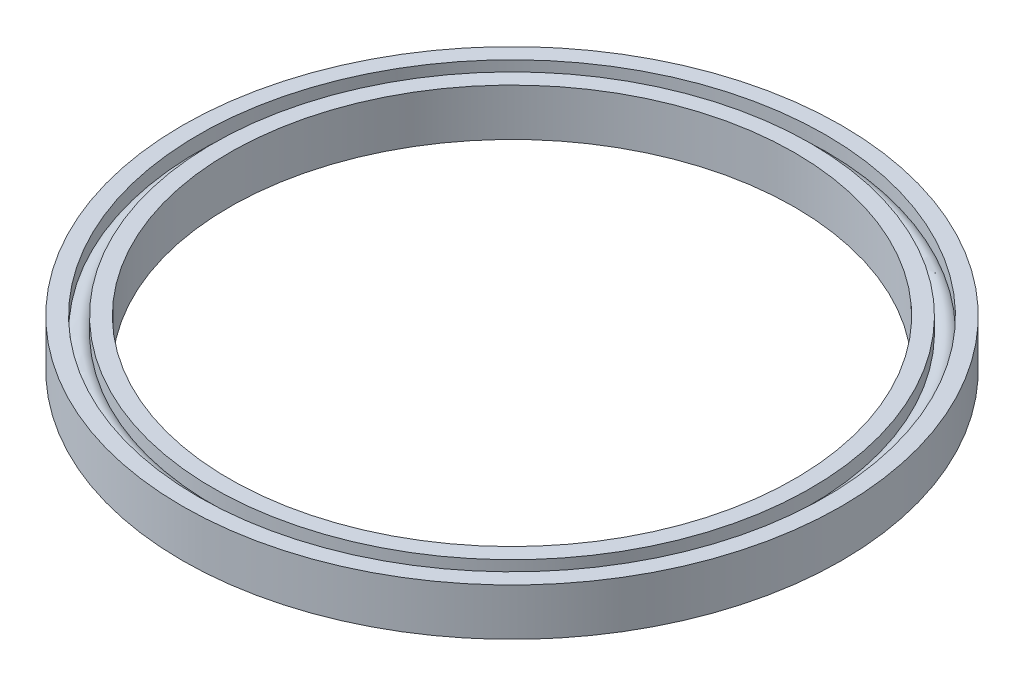
ISO-10303-21;
HEADER;
FILE_DESCRIPTION(('STEP AP214'),'2;1');
FILE_NAME('part.step','',(''),(''),'','','');
FILE_SCHEMA(('AUTOMOTIVE_DESIGN { 1 0 10303 214 1 1 1 1 }'));
ENDSEC;
DATA;
#1=APPLICATION_CONTEXT('core data for automotive mechanical design processes');
#2=APPLICATION_PROTOCOL_DEFINITION('international standard','automotive_design',2000,#1);
#3=PRODUCT_CONTEXT('',#1,'mechanical');
#4=PRODUCT('Part','Part','',(#3));
#5=PRODUCT_RELATED_PRODUCT_CATEGORY('part','',(#4));
#6=PRODUCT_DEFINITION_FORMATION('','',#4);
#7=PRODUCT_DEFINITION_CONTEXT('part definition',#1,'design');
#8=PRODUCT_DEFINITION('design','',#6,#7);
#9=PRODUCT_DEFINITION_SHAPE('','',#8);
#10=(LENGTH_UNIT() NAMED_UNIT(*) SI_UNIT(.MILLI.,.METRE.));
#11=(NAMED_UNIT(*) PLANE_ANGLE_UNIT() SI_UNIT($,.RADIAN.));
#12=(NAMED_UNIT(*) SI_UNIT($,.STERADIAN.) SOLID_ANGLE_UNIT());
#13=UNCERTAINTY_MEASURE_WITH_UNIT(LENGTH_MEASURE(1.E-05),#10,'distance_accuracy_value','');
#14=(GEOMETRIC_REPRESENTATION_CONTEXT(3) GLOBAL_UNCERTAINTY_ASSIGNED_CONTEXT((#13)) GLOBAL_UNIT_ASSIGNED_CONTEXT((#10,
#11,#12)) REPRESENTATION_CONTEXT('',''));
#15=CARTESIAN_POINT('',(0.,0.,0.));
#16=DIRECTION('',(0.,0.,1.));
#17=DIRECTION('',(1.,0.,0.));
#18=AXIS2_PLACEMENT_3D('',#15,#16,#17);
#19=CARTESIAN_POINT('',(0.,13.35,0.));
#20=DIRECTION('',(0.,-1.,0.));
#21=DIRECTION('',(0.,0.,-1.));
#22=AXIS2_PLACEMENT_3D('',#19,#20,#21);
#23=CYLINDRICAL_SURFACE('',#22,42.275);
#24=CARTESIAN_POINT('',(0.,4.40794616670801,0.));
#25=DIRECTION('',(0.,-1.,0.));
#26=DIRECTION('',(0.,0.,-1.));
#27=AXIS2_PLACEMENT_3D('',#24,#25,#26);
#28=CIRCLE('',#27,42.275);
#29=CARTESIAN_POINT('',(0.,4.40794616670801,-42.275));
#30=VERTEX_POINT('',#29);
#31=EDGE_CURVE('E10',#30,#30,#28,.T.);
#32=ORIENTED_EDGE('',*,*,#31,.T.);
#33=EDGE_LOOP('',(#32));
#34=FACE_BOUND('',#33,.T.);
#35=CARTESIAN_POINT('',(0.,6.35,0.));
#36=DIRECTION('',(0.,-1.,0.));
#37=DIRECTION('',(0.,0.,-1.));
#38=AXIS2_PLACEMENT_3D('',#35,#36,#37);
#39=CIRCLE('',#38,42.275);
#40=CARTESIAN_POINT('',(0.,6.35,-42.275));
#41=VERTEX_POINT('',#40);
#42=EDGE_CURVE('E81',#41,#41,#39,.T.);
#43=ORIENTED_EDGE('',*,*,#42,.F.);
#44=EDGE_LOOP('',(#43));
#45=FACE_BOUND('',#44,.T.);
#46=ADVANCED_FACE('F41',(#34,#45),#23,.F.);
#47=CARTESIAN_POINT('',(0.,3.175,0.));
#48=DIRECTION('',(0.,-1.,0.));
#49=DIRECTION('',(0.,0.,-1.));
#50=AXIS2_PLACEMENT_3D('',#47,#48,#49);
#51=TOROIDAL_SURFACE('',#50,41.275,1.5875);
#52=CARTESIAN_POINT('',(0.,4.40794616670801,0.));
#53=DIRECTION('',(0.,-1.,0.));
#54=DIRECTION('',(0.,0.,-1.));
#55=AXIS2_PLACEMENT_3D('',#52,#53,#54);
#56=CIRCLE('',#55,40.275);
#57=CARTESIAN_POINT('',(0.,4.40794616670801,-40.275));
#58=VERTEX_POINT('',#57);
#59=EDGE_CURVE('E47',#58,#58,#56,.T.);
#60=ORIENTED_EDGE('',*,*,#59,.T.);
#61=EDGE_LOOP('',(#60));
#62=FACE_BOUND('',#61,.T.);
#63=ORIENTED_EDGE('',*,*,#31,.F.);
#64=EDGE_LOOP('',(#63));
#65=FACE_BOUND('',#64,.T.);
#66=ADVANCED_FACE('F88',(#62,#65),#51,.T.);
#67=CARTESIAN_POINT('',(0.,13.35,0.));
#68=DIRECTION('',(0.,-1.,0.));
#69=DIRECTION('',(0.,0.,-1.));
#70=AXIS2_PLACEMENT_3D('',#67,#68,#69);
#71=CYLINDRICAL_SURFACE('',#70,40.275);
#72=ORIENTED_EDGE('',*,*,#59,.F.);
#73=EDGE_LOOP('',(#72));
#74=FACE_BOUND('',#73,.T.);
#75=CARTESIAN_POINT('',(0.,6.35,0.));
#76=DIRECTION('',(0.,-1.,0.));
#77=DIRECTION('',(0.,0.,-1.));
#78=AXIS2_PLACEMENT_3D('',#75,#76,#77);
#79=CIRCLE('',#78,40.275);
#80=CARTESIAN_POINT('',(0.,6.35,-40.275));
#81=VERTEX_POINT('',#80);
#82=EDGE_CURVE('E51',#81,#81,#79,.T.);
#83=ORIENTED_EDGE('',*,*,#82,.T.);
#84=EDGE_LOOP('',(#83));
#85=FACE_BOUND('',#84,.T.);
#86=ADVANCED_FACE('F92',(#74,#85),#71,.T.);
#87=CARTESIAN_POINT('',(0.,6.35,0.));
#88=DIRECTION('',(0.,-1.,0.));
#89=DIRECTION('',(0.,0.,-1.));
#90=AXIS2_PLACEMENT_3D('',#87,#88,#89);
#91=PLANE('',#90);
#92=ORIENTED_EDGE('',*,*,#82,.F.);
#93=EDGE_LOOP('',(#92));
#94=FACE_BOUND('',#93,.T.);
#95=CARTESIAN_POINT('',(0.,6.35,0.));
#96=DIRECTION('',(0.,-1.,0.));
#97=DIRECTION('',(0.,0.,-1.));
#98=AXIS2_PLACEMENT_3D('',#95,#96,#97);
#99=CIRCLE('',#98,38.1);
#100=CARTESIAN_POINT('',(0.,6.35,-38.1));
#101=VERTEX_POINT('',#100);
#102=EDGE_CURVE('E55',#101,#101,#99,.T.);
#103=ORIENTED_EDGE('',*,*,#102,.T.);
#104=EDGE_LOOP('',(#103));
#105=FACE_BOUND('',#104,.T.);
#106=ADVANCED_FACE('F98',(#94,#105),#91,.F.);
#107=CARTESIAN_POINT('',(0.,13.35,0.));
#108=DIRECTION('',(0.,-1.,0.));
#109=DIRECTION('',(0.,0.,-1.));
#110=AXIS2_PLACEMENT_3D('',#107,#108,#109);
#111=CYLINDRICAL_SURFACE('',#110,38.1);
#112=CARTESIAN_POINT('',(0.,0.,0.));
#113=DIRECTION('',(0.,-1.,0.));
#114=DIRECTION('',(0.,0.,-1.));
#115=AXIS2_PLACEMENT_3D('',#112,#113,#114);
#116=CIRCLE('',#115,38.1);
#117=CARTESIAN_POINT('',(0.,0.,-38.1));
#118=VERTEX_POINT('',#117);
#119=EDGE_CURVE('E60',#118,#118,#116,.T.);
#120=ORIENTED_EDGE('',*,*,#119,.T.);
#121=EDGE_LOOP('',(#120));
#122=FACE_BOUND('',#121,.T.);
#123=ORIENTED_EDGE('',*,*,#102,.F.);
#124=EDGE_LOOP('',(#123));
#125=FACE_BOUND('',#124,.T.);
#126=ADVANCED_FACE('F123',(#122,#125),#111,.F.);
#127=CARTESIAN_POINT('',(0.,0.,0.));
#128=DIRECTION('',(0.,-1.,0.));
#129=DIRECTION('',(0.,0.,-1.));
#130=AXIS2_PLACEMENT_3D('',#127,#128,#129);
#131=PLANE('',#130);
#132=CARTESIAN_POINT('',(0.,0.,0.));
#133=DIRECTION('',(0.,-1.,0.));
#134=DIRECTION('',(0.,0.,-1.));
#135=AXIS2_PLACEMENT_3D('',#132,#133,#134);
#136=CIRCLE('',#135,40.275);
#137=CARTESIAN_POINT('',(0.,0.,-40.275));
#138=VERTEX_POINT('',#137);
#139=EDGE_CURVE('E63',#138,#138,#136,.T.);
#140=ORIENTED_EDGE('',*,*,#139,.T.);
#141=EDGE_LOOP('',(#140));
#142=FACE_BOUND('',#141,.T.);
#143=ORIENTED_EDGE('',*,*,#119,.F.);
#144=EDGE_LOOP('',(#143));
#145=FACE_BOUND('',#144,.T.);
#146=ADVANCED_FACE('F113',(#142,#145),#131,.T.);
#147=CARTESIAN_POINT('',(0.,13.35,0.));
#148=DIRECTION('',(0.,-1.,0.));
#149=DIRECTION('',(0.,0.,-1.));
#150=AXIS2_PLACEMENT_3D('',#147,#148,#149);
#151=CYLINDRICAL_SURFACE('',#150,40.275);
#152=ORIENTED_EDGE('',*,*,#139,.F.);
#153=EDGE_LOOP('',(#152));
#154=FACE_BOUND('',#153,.T.);
#155=CARTESIAN_POINT('',(0.,1.94205383329199,0.));
#156=DIRECTION('',(0.,-1.,0.));
#157=DIRECTION('',(0.,0.,-1.));
#158=AXIS2_PLACEMENT_3D('',#155,#156,#157);
#159=CIRCLE('',#158,40.275);
#160=CARTESIAN_POINT('',(0.,1.94205383329199,-40.275));
#161=VERTEX_POINT('',#160);
#162=EDGE_CURVE('E66',#161,#161,#159,.T.);
#163=ORIENTED_EDGE('',*,*,#162,.T.);
#164=EDGE_LOOP('',(#163));
#165=FACE_BOUND('',#164,.T.);
#166=ADVANCED_FACE('F105',(#154,#165),#151,.T.);
#167=CARTESIAN_POINT('',(0.,1.94205383329199,0.));
#168=DIRECTION('',(0.,-1.,0.));
#169=DIRECTION('',(0.,0.,-1.));
#170=AXIS2_PLACEMENT_3D('',#167,#168,#169);
#171=CIRCLE('',#170,42.275);
#172=CARTESIAN_POINT('',(0.,1.94205383329199,-42.275));
#173=VERTEX_POINT('',#172);
#174=EDGE_CURVE('E69',#173,#173,#171,.T.);
#175=ORIENTED_EDGE('',*,*,#174,.T.);
#176=EDGE_LOOP('',(#175));
#177=FACE_BOUND('',#176,.T.);
#178=ORIENTED_EDGE('',*,*,#162,.F.);
#179=EDGE_LOOP('',(#178));
#180=FACE_BOUND('',#179,.T.);
#181=ADVANCED_FACE('F94',(#177,#180),#51,.T.);
#182=CARTESIAN_POINT('',(0.,13.35,0.));
#183=DIRECTION('',(0.,-1.,0.));
#184=DIRECTION('',(0.,0.,-1.));
#185=AXIS2_PLACEMENT_3D('',#182,#183,#184);
#186=CYLINDRICAL_SURFACE('',#185,42.275);
#187=CARTESIAN_POINT('',(0.,0.,0.));
#188=DIRECTION('',(0.,-1.,0.));
#189=DIRECTION('',(0.,0.,-1.));
#190=AXIS2_PLACEMENT_3D('',#187,#188,#189);
#191=CIRCLE('',#190,42.275);
#192=CARTESIAN_POINT('',(0.,0.,-42.275));
#193=VERTEX_POINT('',#192);
#194=EDGE_CURVE('E72',#193,#193,#191,.T.);
#195=ORIENTED_EDGE('',*,*,#194,.T.);
#196=EDGE_LOOP('',(#195));
#197=FACE_BOUND('',#196,.T.);
#198=ORIENTED_EDGE('',*,*,#174,.F.);
#199=EDGE_LOOP('',(#198));
#200=FACE_BOUND('',#199,.T.);
#201=ADVANCED_FACE('F104',(#197,#200),#186,.F.);
#202=CARTESIAN_POINT('',(0.,0.,0.));
#203=DIRECTION('',(0.,-1.,0.));
#204=DIRECTION('',(0.,0.,-1.));
#205=AXIS2_PLACEMENT_3D('',#202,#203,#204);
#206=PLANE('',#205);
#207=CARTESIAN_POINT('',(0.,0.,0.));
#208=DIRECTION('',(0.,-1.,0.));
#209=DIRECTION('',(0.,0.,-1.));
#210=AXIS2_PLACEMENT_3D('',#207,#208,#209);
#211=CIRCLE('',#210,44.45);
#212=CARTESIAN_POINT('',(0.,0.,-44.45));
#213=VERTEX_POINT('',#212);
#214=EDGE_CURVE('E75',#213,#213,#211,.T.);
#215=ORIENTED_EDGE('',*,*,#214,.T.);
#216=EDGE_LOOP('',(#215));
#217=FACE_BOUND('',#216,.T.);
#218=ORIENTED_EDGE('',*,*,#194,.F.);
#219=EDGE_LOOP('',(#218));
#220=FACE_BOUND('',#219,.T.);
#221=ADVANCED_FACE('F111',(#217,#220),#206,.T.);
#222=CARTESIAN_POINT('',(0.,13.35,0.));
#223=DIRECTION('',(0.,-1.,0.));
#224=DIRECTION('',(0.,0.,-1.));
#225=AXIS2_PLACEMENT_3D('',#222,#223,#224);
#226=CYLINDRICAL_SURFACE('',#225,44.45);
#227=ORIENTED_EDGE('',*,*,#214,.F.);
#228=EDGE_LOOP('',(#227));
#229=FACE_BOUND('',#228,.T.);
#230=CARTESIAN_POINT('',(0.,6.35,0.));
#231=DIRECTION('',(0.,-1.,0.));
#232=DIRECTION('',(0.,0.,-1.));
#233=AXIS2_PLACEMENT_3D('',#230,#231,#232);
#234=CIRCLE('',#233,44.45);
#235=CARTESIAN_POINT('',(0.,6.35,-44.45));
#236=VERTEX_POINT('',#235);
#237=EDGE_CURVE('E78',#236,#236,#234,.T.);
#238=ORIENTED_EDGE('',*,*,#237,.T.);
#239=EDGE_LOOP('',(#238));
#240=FACE_BOUND('',#239,.T.);
#241=ADVANCED_FACE('F179',(#229,#240),#226,.T.);
#242=CARTESIAN_POINT('',(0.,6.35,0.));
#243=DIRECTION('',(0.,-1.,0.));
#244=DIRECTION('',(0.,0.,-1.));
#245=AXIS2_PLACEMENT_3D('',#242,#243,#244);
#246=PLANE('',#245);
#247=ORIENTED_EDGE('',*,*,#237,.F.);
#248=EDGE_LOOP('',(#247));
#249=FACE_BOUND('',#248,.T.);
#250=ORIENTED_EDGE('',*,*,#42,.T.);
#251=EDGE_LOOP('',(#250));
#252=FACE_BOUND('',#251,.T.);
#253=ADVANCED_FACE('F85',(#249,#252),#246,.F.);
#254=CLOSED_SHELL('',(#46,#66,#86,#106,#126,#146,#166,#181,#201,#221,#241,#253));
#255=MANIFOLD_SOLID_BREP('B2',#254);
#256=ADVANCED_BREP_SHAPE_REPRESENTATION('',(#18,#255),#14);
#257=SHAPE_DEFINITION_REPRESENTATION(#9,#256);
ENDSEC;
END-ISO-10303-21;
